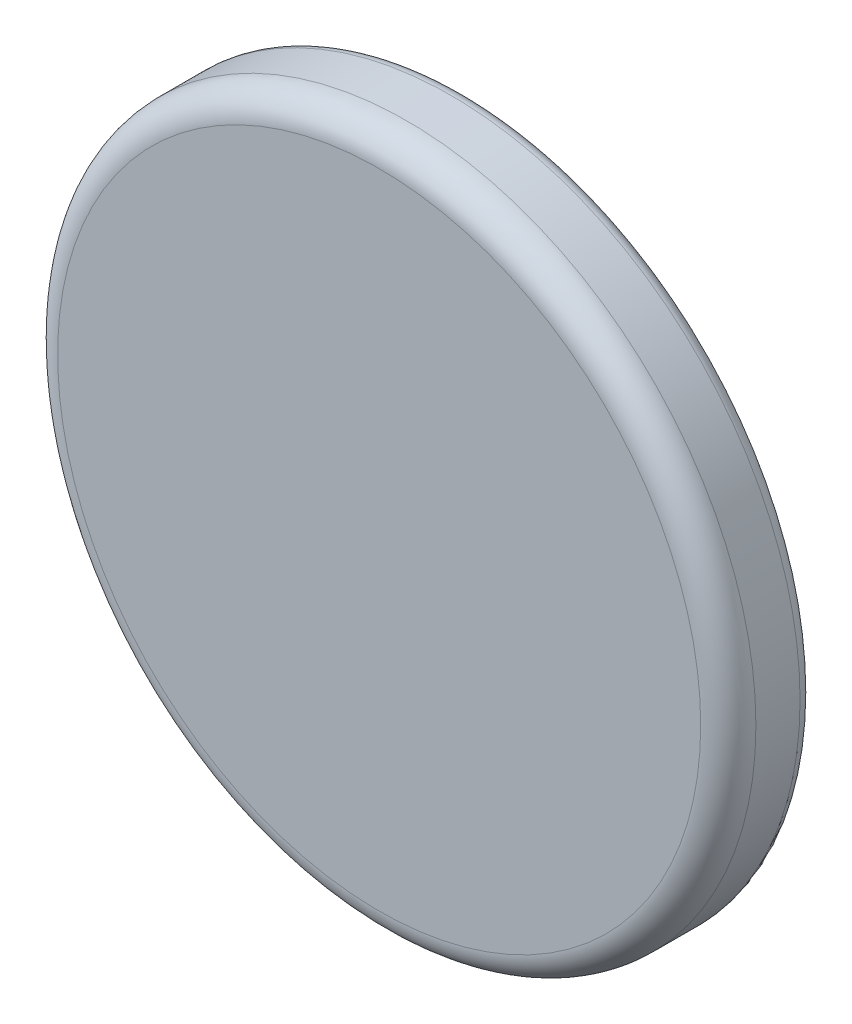
ISO-10303-21;
HEADER;
FILE_DESCRIPTION(('STEP AP214'),'2;1');
FILE_NAME('part.step','',(''),(''),'','','');
FILE_SCHEMA(('AUTOMOTIVE_DESIGN { 1 0 10303 214 1 1 1 1 }'));
ENDSEC;
DATA;
#1=APPLICATION_CONTEXT('core data for automotive mechanical design processes');
#2=APPLICATION_PROTOCOL_DEFINITION('international standard','automotive_design',2000,#1);
#3=PRODUCT_CONTEXT('',#1,'mechanical');
#4=PRODUCT('Part','Part','',(#3));
#5=PRODUCT_RELATED_PRODUCT_CATEGORY('part','',(#4));
#6=PRODUCT_DEFINITION_FORMATION('','',#4);
#7=PRODUCT_DEFINITION_CONTEXT('part definition',#1,'design');
#8=PRODUCT_DEFINITION('design','',#6,#7);
#9=PRODUCT_DEFINITION_SHAPE('','',#8);
#10=(LENGTH_UNIT() NAMED_UNIT(*) SI_UNIT(.MILLI.,.METRE.));
#11=(NAMED_UNIT(*) PLANE_ANGLE_UNIT() SI_UNIT($,.RADIAN.));
#12=(NAMED_UNIT(*) SI_UNIT($,.STERADIAN.) SOLID_ANGLE_UNIT());
#13=UNCERTAINTY_MEASURE_WITH_UNIT(LENGTH_MEASURE(1.E-05),#10,'distance_accuracy_value','');
#14=(GEOMETRIC_REPRESENTATION_CONTEXT(3) GLOBAL_UNCERTAINTY_ASSIGNED_CONTEXT((#13)) GLOBAL_UNIT_ASSIGNED_CONTEXT((#10,
#11,#12)) REPRESENTATION_CONTEXT('',''));
#15=CARTESIAN_POINT('',(0.,0.,0.));
#16=DIRECTION('',(0.,0.,1.));
#17=DIRECTION('',(1.,0.,0.));
#18=AXIS2_PLACEMENT_3D('',#15,#16,#17);
#19=CARTESIAN_POINT('',(0.,0.,-1.6));
#20=DIRECTION('',(0.,0.,1.));
#21=DIRECTION('',(1.,0.,0.));
#22=AXIS2_PLACEMENT_3D('',#19,#20,#21);
#23=TOROIDAL_SURFACE('',#22,12.15,0.5);
#24=CARTESIAN_POINT('',(0.,0.,-1.6));
#25=DIRECTION('',(0.,0.,1.));
#26=DIRECTION('',(1.,0.,0.));
#27=AXIS2_PLACEMENT_3D('',#24,#25,#26);
#28=CIRCLE('',#27,12.65);
#29=CARTESIAN_POINT('',(12.65,0.,-1.6));
#30=VERTEX_POINT('',#29);
#31=EDGE_CURVE('E254',#30,#30,#28,.T.);
#32=ORIENTED_EDGE('',*,*,#31,.F.);
#33=EDGE_LOOP('',(#32));
#34=FACE_BOUND('',#33,.T.);
#35=CARTESIAN_POINT('',(0.,0.,-2.1));
#36=DIRECTION('',(0.,0.,1.));
#37=DIRECTION('',(1.,0.,0.));
#38=AXIS2_PLACEMENT_3D('',#35,#36,#37);
#39=CIRCLE('',#38,12.15);
#40=CARTESIAN_POINT('',(12.15,0.,-2.1));
#41=VERTEX_POINT('',#40);
#42=EDGE_CURVE('E250',#41,#41,#39,.T.);
#43=ORIENTED_EDGE('',*,*,#42,.T.);
#44=EDGE_LOOP('',(#43));
#45=FACE_BOUND('',#44,.T.);
#46=ADVANCED_FACE('F47',(#34,#45),#23,.T.);
#47=CARTESIAN_POINT('',(0.,0.,-1.6));
#48=DIRECTION('',(0.,0.,1.));
#49=DIRECTION('',(1.,0.,0.));
#50=AXIS2_PLACEMENT_3D('',#47,#48,#49);
#51=TOROIDAL_SURFACE('',#50,12.15,0.5);
#52=CARTESIAN_POINT('',(0.,0.,-1.6));
#53=DIRECTION('',(0.,0.,1.));
#54=DIRECTION('',(1.,0.,0.));
#55=AXIS2_PLACEMENT_3D('',#52,#53,#54);
#56=CIRCLE('',#55,11.65);
#57=CARTESIAN_POINT('',(11.65,0.,-1.6));
#58=VERTEX_POINT('',#57);
#59=EDGE_CURVE('E246',#58,#58,#56,.F.);
#60=ORIENTED_EDGE('',*,*,#59,.F.);
#61=EDGE_LOOP('',(#60));
#62=FACE_BOUND('',#61,.T.);
#63=ORIENTED_EDGE('',*,*,#42,.F.);
#64=EDGE_LOOP('',(#63));
#65=FACE_BOUND('',#64,.T.);
#66=ADVANCED_FACE('F276',(#62,#65),#51,.T.);
#67=CARTESIAN_POINT('',(0.55,0.,-2.1));
#68=DIRECTION('',(1.,0.,0.));
#69=DIRECTION('',(0.,1.,0.));
#70=AXIS2_PLACEMENT_3D('',#67,#68,#69);
#71=PLANE('',#70);
#72=DIRECTION('',(0.,1.,0.));
#73=VECTOR('',#72,1.);
#74=CARTESIAN_POINT('',(0.55,0.,0.));
#75=LINE('',#74,#73);
#76=CARTESIAN_POINT('',(0.550000000000001,-2.,0.));
#77=VERTEX_POINT('',#76);
#78=CARTESIAN_POINT('',(0.55,-0.55,0.));
#79=VERTEX_POINT('',#78);
#80=EDGE_CURVE('E136',#77,#79,#75,.T.);
#81=ORIENTED_EDGE('',*,*,#80,.T.);
#82=DIRECTION('',(0.,0.,1.));
#83=VECTOR('',#82,1.);
#84=CARTESIAN_POINT('',(0.55,-0.55,-2.1));
#85=LINE('',#84,#83);
#86=CARTESIAN_POINT('',(0.55,-0.55,-2.1));
#87=VERTEX_POINT('',#86);
#88=EDGE_CURVE('E145',#87,#79,#85,.T.);
#89=ORIENTED_EDGE('',*,*,#88,.F.);
#90=DIRECTION('',(0.,1.,0.));
#91=VECTOR('',#90,1.);
#92=CARTESIAN_POINT('',(0.55,0.,-2.1));
#93=LINE('',#92,#91);
#94=CARTESIAN_POINT('',(0.550000000000001,-2.,-2.1));
#95=VERTEX_POINT('',#94);
#96=EDGE_CURVE('E197',#95,#87,#93,.T.);
#97=ORIENTED_EDGE('',*,*,#96,.F.);
#98=DIRECTION('',(0.,0.,1.));
#99=VECTOR('',#98,1.);
#100=CARTESIAN_POINT('',(0.550000000000001,-2.,-2.1));
#101=LINE('',#100,#99);
#102=EDGE_CURVE('E156',#95,#77,#101,.T.);
#103=ORIENTED_EDGE('',*,*,#102,.T.);
#104=EDGE_LOOP('',(#81,#89,#97,#103));
#105=FACE_BOUND('',#104,.T.);
#106=ADVANCED_FACE('F154',(#105),#71,.F.);
#107=CARTESIAN_POINT('',(0.,-0.55,-2.1));
#108=DIRECTION('',(0.,-1.,0.));
#109=DIRECTION('',(1.,0.,0.));
#110=AXIS2_PLACEMENT_3D('',#107,#108,#109);
#111=PLANE('',#110);
#112=DIRECTION('',(1.,0.,0.));
#113=VECTOR('',#112,1.);
#114=CARTESIAN_POINT('',(0.,-0.55,0.));
#115=LINE('',#114,#113);
#116=CARTESIAN_POINT('',(2.,-0.55,0.));
#117=VERTEX_POINT('',#116);
#118=EDGE_CURVE('E133',#79,#117,#115,.T.);
#119=ORIENTED_EDGE('',*,*,#118,.T.);
#120=DIRECTION('',(0.,0.,1.));
#121=VECTOR('',#120,1.);
#122=CARTESIAN_POINT('',(2.,-0.55,-2.1));
#123=LINE('',#122,#121);
#124=CARTESIAN_POINT('',(2.,-0.55,-2.1));
#125=VERTEX_POINT('',#124);
#126=EDGE_CURVE('E151',#125,#117,#123,.T.);
#127=ORIENTED_EDGE('',*,*,#126,.F.);
#128=DIRECTION('',(1.,0.,0.));
#129=VECTOR('',#128,1.);
#130=CARTESIAN_POINT('',(0.,-0.55,-2.1));
#131=LINE('',#130,#129);
#132=EDGE_CURVE('E64',#87,#125,#131,.T.);
#133=ORIENTED_EDGE('',*,*,#132,.F.);
#134=ORIENTED_EDGE('',*,*,#88,.T.);
#135=EDGE_LOOP('',(#119,#127,#133,#134));
#136=FACE_BOUND('',#135,.T.);
#137=ADVANCED_FACE('F146',(#136),#111,.F.);
#138=CARTESIAN_POINT('',(2.,0.,-2.1));
#139=DIRECTION('',(-1.,0.,0.));
#140=DIRECTION('',(0.,-1.,0.));
#141=AXIS2_PLACEMENT_3D('',#138,#139,#140);
#142=PLANE('',#141);
#143=DIRECTION('',(0.,-1.,0.));
#144=VECTOR('',#143,1.);
#145=CARTESIAN_POINT('',(2.,0.,0.));
#146=LINE('',#145,#144);
#147=CARTESIAN_POINT('',(2.,0.550000000000001,0.));
#148=VERTEX_POINT('',#147);
#149=EDGE_CURVE('E139',#148,#117,#146,.T.);
#150=ORIENTED_EDGE('',*,*,#149,.F.);
#151=DIRECTION('',(0.,0.,1.));
#152=VECTOR('',#151,1.);
#153=CARTESIAN_POINT('',(2.,0.550000000000001,-2.1));
#154=LINE('',#153,#152);
#155=CARTESIAN_POINT('',(2.,0.550000000000001,-2.1));
#156=VERTEX_POINT('',#155);
#157=EDGE_CURVE('E201',#156,#148,#154,.T.);
#158=ORIENTED_EDGE('',*,*,#157,.F.);
#159=DIRECTION('',(0.,-1.,0.));
#160=VECTOR('',#159,1.);
#161=CARTESIAN_POINT('',(2.,0.,-2.1));
#162=LINE('',#161,#160);
#163=EDGE_CURVE('E499',#156,#125,#162,.T.);
#164=ORIENTED_EDGE('',*,*,#163,.T.);
#165=ORIENTED_EDGE('',*,*,#126,.T.);
#166=EDGE_LOOP('',(#150,#158,#164,#165));
#167=FACE_BOUND('',#166,.T.);
#168=ADVANCED_FACE('F325',(#167),#142,.T.);
#169=CARTESIAN_POINT('',(0.,0.55,-2.1));
#170=DIRECTION('',(0.,1.,0.));
#171=DIRECTION('',(-1.,0.,0.));
#172=AXIS2_PLACEMENT_3D('',#169,#170,#171);
#173=PLANE('',#172);
#174=DIRECTION('',(-1.,0.,0.));
#175=VECTOR('',#174,1.);
#176=CARTESIAN_POINT('',(0.,0.55,0.));
#177=LINE('',#176,#175);
#178=CARTESIAN_POINT('',(0.55,0.55,0.));
#179=VERTEX_POINT('',#178);
#180=EDGE_CURVE('E189',#148,#179,#177,.T.);
#181=ORIENTED_EDGE('',*,*,#180,.T.);
#182=DIRECTION('',(0.,0.,1.));
#183=VECTOR('',#182,1.);
#184=CARTESIAN_POINT('',(0.55,0.55,-2.1));
#185=LINE('',#184,#183);
#186=CARTESIAN_POINT('',(0.55,0.55,-2.1));
#187=VERTEX_POINT('',#186);
#188=EDGE_CURVE('E205',#187,#179,#185,.T.);
#189=ORIENTED_EDGE('',*,*,#188,.F.);
#190=DIRECTION('',(-1.,0.,0.));
#191=VECTOR('',#190,1.);
#192=CARTESIAN_POINT('',(0.,0.55,-2.1));
#193=LINE('',#192,#191);
#194=EDGE_CURVE('E503',#156,#187,#193,.T.);
#195=ORIENTED_EDGE('',*,*,#194,.F.);
#196=ORIENTED_EDGE('',*,*,#157,.T.);
#197=EDGE_LOOP('',(#181,#189,#195,#196));
#198=FACE_BOUND('',#197,.T.);
#199=ADVANCED_FACE('F321',(#198),#173,.F.);
#200=CARTESIAN_POINT('',(0.55,0.,-2.1));
#201=DIRECTION('',(-1.,0.,0.));
#202=DIRECTION('',(0.,-1.,0.));
#203=AXIS2_PLACEMENT_3D('',#200,#201,#202);
#204=PLANE('',#203);
#205=DIRECTION('',(0.,-1.,0.));
#206=VECTOR('',#205,1.);
#207=CARTESIAN_POINT('',(0.55,0.,0.));
#208=LINE('',#207,#206);
#209=CARTESIAN_POINT('',(0.55,2.,0.));
#210=VERTEX_POINT('',#209);
#211=EDGE_CURVE('E186',#210,#179,#208,.T.);
#212=ORIENTED_EDGE('',*,*,#211,.F.);
#213=DIRECTION('',(0.,0.,1.));
#214=VECTOR('',#213,1.);
#215=CARTESIAN_POINT('',(0.55,2.,-2.1));
#216=LINE('',#215,#214);
#217=CARTESIAN_POINT('',(0.55,2.,-2.1));
#218=VERTEX_POINT('',#217);
#219=EDGE_CURVE('E209',#218,#210,#216,.T.);
#220=ORIENTED_EDGE('',*,*,#219,.F.);
#221=DIRECTION('',(0.,-1.,0.));
#222=VECTOR('',#221,1.);
#223=CARTESIAN_POINT('',(0.55,0.,-2.1));
#224=LINE('',#223,#222);
#225=EDGE_CURVE('E508',#218,#187,#224,.T.);
#226=ORIENTED_EDGE('',*,*,#225,.T.);
#227=ORIENTED_EDGE('',*,*,#188,.T.);
#228=EDGE_LOOP('',(#212,#220,#226,#227));
#229=FACE_BOUND('',#228,.T.);
#230=ADVANCED_FACE('F317',(#229),#204,.T.);
#231=CARTESIAN_POINT('',(0.,2.,-2.1));
#232=DIRECTION('',(0.,1.,0.));
#233=DIRECTION('',(-1.,0.,0.));
#234=AXIS2_PLACEMENT_3D('',#231,#232,#233);
#235=PLANE('',#234);
#236=DIRECTION('',(-1.,0.,0.));
#237=VECTOR('',#236,1.);
#238=CARTESIAN_POINT('',(0.,2.,0.));
#239=LINE('',#238,#237);
#240=CARTESIAN_POINT('',(-0.55,2.,0.));
#241=VERTEX_POINT('',#240);
#242=EDGE_CURVE('E182',#210,#241,#239,.T.);
#243=ORIENTED_EDGE('',*,*,#242,.T.);
#244=DIRECTION('',(0.,0.,1.));
#245=VECTOR('',#244,1.);
#246=CARTESIAN_POINT('',(-0.55,2.,-2.1));
#247=LINE('',#246,#245);
#248=CARTESIAN_POINT('',(-0.55,2.,-2.1));
#249=VERTEX_POINT('',#248);
#250=EDGE_CURVE('E213',#249,#241,#247,.T.);
#251=ORIENTED_EDGE('',*,*,#250,.F.);
#252=DIRECTION('',(-1.,0.,0.));
#253=VECTOR('',#252,1.);
#254=CARTESIAN_POINT('',(0.,2.,-2.1));
#255=LINE('',#254,#253);
#256=EDGE_CURVE('E512',#218,#249,#255,.T.);
#257=ORIENTED_EDGE('',*,*,#256,.F.);
#258=ORIENTED_EDGE('',*,*,#219,.T.);
#259=EDGE_LOOP('',(#243,#251,#257,#258));
#260=FACE_BOUND('',#259,.T.);
#261=ADVANCED_FACE('F313',(#260),#235,.F.);
#262=CARTESIAN_POINT('',(-0.55,0.,-2.1));
#263=DIRECTION('',(1.,0.,0.));
#264=DIRECTION('',(0.,1.,0.));
#265=AXIS2_PLACEMENT_3D('',#262,#263,#264);
#266=PLANE('',#265);
#267=DIRECTION('',(0.,1.,0.));
#268=VECTOR('',#267,1.);
#269=CARTESIAN_POINT('',(-0.55,0.,0.));
#270=LINE('',#269,#268);
#271=CARTESIAN_POINT('',(-0.55,0.55,0.));
#272=VERTEX_POINT('',#271);
#273=EDGE_CURVE('E179',#272,#241,#270,.T.);
#274=ORIENTED_EDGE('',*,*,#273,.F.);
#275=DIRECTION('',(0.,0.,1.));
#276=VECTOR('',#275,1.);
#277=CARTESIAN_POINT('',(-0.55,0.55,-2.1));
#278=LINE('',#277,#276);
#279=CARTESIAN_POINT('',(-0.55,0.55,-2.1));
#280=VERTEX_POINT('',#279);
#281=EDGE_CURVE('E217',#280,#272,#278,.T.);
#282=ORIENTED_EDGE('',*,*,#281,.F.);
#283=DIRECTION('',(0.,1.,0.));
#284=VECTOR('',#283,1.);
#285=CARTESIAN_POINT('',(-0.55,0.,-2.1));
#286=LINE('',#285,#284);
#287=EDGE_CURVE('E515',#280,#249,#286,.T.);
#288=ORIENTED_EDGE('',*,*,#287,.T.);
#289=ORIENTED_EDGE('',*,*,#250,.T.);
#290=EDGE_LOOP('',(#274,#282,#288,#289));
#291=FACE_BOUND('',#290,.T.);
#292=ADVANCED_FACE('F309',(#291),#266,.T.);
#293=CARTESIAN_POINT('',(0.,0.55,-2.1));
#294=DIRECTION('',(0.,-1.,0.));
#295=DIRECTION('',(0.,0.,-1.));
#296=AXIS2_PLACEMENT_3D('',#293,#294,#295);
#297=PLANE('',#296);
#298=DIRECTION('',(1.,0.,0.));
#299=VECTOR('',#298,1.);
#300=CARTESIAN_POINT('',(0.,0.55,0.));
#301=LINE('',#300,#299);
#302=CARTESIAN_POINT('',(-2.,0.55,0.));
#303=VERTEX_POINT('',#302);
#304=EDGE_CURVE('E176',#303,#272,#301,.T.);
#305=ORIENTED_EDGE('',*,*,#304,.F.);
#306=DIRECTION('',(0.,0.,1.));
#307=VECTOR('',#306,1.);
#308=CARTESIAN_POINT('',(-2.,0.55,-2.1));
#309=LINE('',#308,#307);
#310=CARTESIAN_POINT('',(-2.,0.55,-2.1));
#311=VERTEX_POINT('',#310);
#312=EDGE_CURVE('E221',#311,#303,#309,.T.);
#313=ORIENTED_EDGE('',*,*,#312,.F.);
#314=DIRECTION('',(1.,0.,0.));
#315=VECTOR('',#314,1.);
#316=CARTESIAN_POINT('',(0.,0.55,-2.1));
#317=LINE('',#316,#315);
#318=EDGE_CURVE('E519',#311,#280,#317,.T.);
#319=ORIENTED_EDGE('',*,*,#318,.T.);
#320=ORIENTED_EDGE('',*,*,#281,.T.);
#321=EDGE_LOOP('',(#305,#313,#319,#320));
#322=FACE_BOUND('',#321,.T.);
#323=ADVANCED_FACE('F305',(#322),#297,.T.);
#324=CARTESIAN_POINT('',(-2.,0.,-2.1));
#325=DIRECTION('',(1.,0.,0.));
#326=DIRECTION('',(0.,0.,-1.));
#327=AXIS2_PLACEMENT_3D('',#324,#325,#326);
#328=PLANE('',#327);
#329=DIRECTION('',(0.,1.,0.));
#330=VECTOR('',#329,1.);
#331=CARTESIAN_POINT('',(-2.,0.,0.));
#332=LINE('',#331,#330);
#333=CARTESIAN_POINT('',(-2.,-0.55,0.));
#334=VERTEX_POINT('',#333);
#335=EDGE_CURVE('E173',#334,#303,#332,.T.);
#336=ORIENTED_EDGE('',*,*,#335,.F.);
#337=DIRECTION('',(0.,0.,1.));
#338=VECTOR('',#337,1.);
#339=CARTESIAN_POINT('',(-2.,-0.55,-2.1));
#340=LINE('',#339,#338);
#341=CARTESIAN_POINT('',(-2.,-0.55,-2.1));
#342=VERTEX_POINT('',#341);
#343=EDGE_CURVE('E225',#342,#334,#340,.T.);
#344=ORIENTED_EDGE('',*,*,#343,.F.);
#345=DIRECTION('',(0.,1.,0.));
#346=VECTOR('',#345,1.);
#347=CARTESIAN_POINT('',(-2.,0.,-2.1));
#348=LINE('',#347,#346);
#349=EDGE_CURVE('E523',#342,#311,#348,.T.);
#350=ORIENTED_EDGE('',*,*,#349,.T.);
#351=ORIENTED_EDGE('',*,*,#312,.T.);
#352=EDGE_LOOP('',(#336,#344,#350,#351));
#353=FACE_BOUND('',#352,.T.);
#354=ADVANCED_FACE('F301',(#353),#328,.T.);
#355=CARTESIAN_POINT('',(0.,-0.55,-2.1));
#356=DIRECTION('',(0.,-1.,0.));
#357=DIRECTION('',(0.,0.,-1.));
#358=AXIS2_PLACEMENT_3D('',#355,#356,#357);
#359=PLANE('',#358);
#360=DIRECTION('',(1.,0.,0.));
#361=VECTOR('',#360,1.);
#362=CARTESIAN_POINT('',(0.,-0.55,0.));
#363=LINE('',#362,#361);
#364=CARTESIAN_POINT('',(-0.55,-0.55,0.));
#365=VERTEX_POINT('',#364);
#366=EDGE_CURVE('E169',#334,#365,#363,.T.);
#367=ORIENTED_EDGE('',*,*,#366,.T.);
#368=DIRECTION('',(0.,0.,1.));
#369=VECTOR('',#368,1.);
#370=CARTESIAN_POINT('',(-0.55,-0.55,-2.1));
#371=LINE('',#370,#369);
#372=CARTESIAN_POINT('',(-0.55,-0.55,-2.1));
#373=VERTEX_POINT('',#372);
#374=EDGE_CURVE('E229',#373,#365,#371,.T.);
#375=ORIENTED_EDGE('',*,*,#374,.F.);
#376=DIRECTION('',(1.,0.,0.));
#377=VECTOR('',#376,1.);
#378=CARTESIAN_POINT('',(0.,-0.55,-2.1));
#379=LINE('',#378,#377);
#380=EDGE_CURVE('E527',#342,#373,#379,.T.);
#381=ORIENTED_EDGE('',*,*,#380,.F.);
#382=ORIENTED_EDGE('',*,*,#343,.T.);
#383=EDGE_LOOP('',(#367,#375,#381,#382));
#384=FACE_BOUND('',#383,.T.);
#385=ADVANCED_FACE('F297',(#384),#359,.F.);
#386=CARTESIAN_POINT('',(-0.55,0.,-2.1));
#387=DIRECTION('',(1.,0.,0.));
#388=DIRECTION('',(0.,1.,0.));
#389=AXIS2_PLACEMENT_3D('',#386,#387,#388);
#390=PLANE('',#389);
#391=DIRECTION('',(0.,1.,0.));
#392=VECTOR('',#391,1.);
#393=CARTESIAN_POINT('',(-0.55,0.,0.));
#394=LINE('',#393,#392);
#395=CARTESIAN_POINT('',(-0.55,-2.,0.));
#396=VERTEX_POINT('',#395);
#397=EDGE_CURVE('E161',#396,#365,#394,.T.);
#398=ORIENTED_EDGE('',*,*,#397,.F.);
#399=DIRECTION('',(0.,0.,1.));
#400=VECTOR('',#399,1.);
#401=CARTESIAN_POINT('',(-0.55,-2.,-2.1));
#402=LINE('',#401,#400);
#403=CARTESIAN_POINT('',(-0.55,-2.,-2.1));
#404=VERTEX_POINT('',#403);
#405=EDGE_CURVE('E233',#404,#396,#402,.T.);
#406=ORIENTED_EDGE('',*,*,#405,.F.);
#407=DIRECTION('',(0.,1.,0.));
#408=VECTOR('',#407,1.);
#409=CARTESIAN_POINT('',(-0.55,0.,-2.1));
#410=LINE('',#409,#408);
#411=EDGE_CURVE('E530',#404,#373,#410,.T.);
#412=ORIENTED_EDGE('',*,*,#411,.T.);
#413=ORIENTED_EDGE('',*,*,#374,.T.);
#414=EDGE_LOOP('',(#398,#406,#412,#413));
#415=FACE_BOUND('',#414,.T.);
#416=ADVANCED_FACE('F293',(#415),#390,.T.);
#417=CARTESIAN_POINT('',(0.,-2.,-2.1));
#418=DIRECTION('',(0.,-1.,0.));
#419=DIRECTION('',(0.,0.,-1.));
#420=AXIS2_PLACEMENT_3D('',#417,#418,#419);
#421=PLANE('',#420);
#422=DIRECTION('',(1.,0.,0.));
#423=VECTOR('',#422,1.);
#424=CARTESIAN_POINT('',(0.,-2.,0.));
#425=LINE('',#424,#423);
#426=EDGE_CURVE('E158',#396,#77,#425,.T.);
#427=ORIENTED_EDGE('',*,*,#426,.T.);
#428=ORIENTED_EDGE('',*,*,#102,.F.);
#429=DIRECTION('',(1.,0.,0.));
#430=VECTOR('',#429,1.);
#431=CARTESIAN_POINT('',(0.,-2.,-2.1));
#432=LINE('',#431,#430);
#433=EDGE_CURVE('E534',#404,#95,#432,.T.);
#434=ORIENTED_EDGE('',*,*,#433,.F.);
#435=ORIENTED_EDGE('',*,*,#405,.T.);
#436=EDGE_LOOP('',(#427,#428,#434,#435));
#437=FACE_BOUND('',#436,.T.);
#438=ADVANCED_FACE('F289',(#437),#421,.F.);
#439=CARTESIAN_POINT('',(0.,0.,-2.1));
#440=DIRECTION('',(0.,0.,1.));
#441=DIRECTION('',(1.,0.,0.));
#442=AXIS2_PLACEMENT_3D('',#439,#440,#441);
#443=CYLINDRICAL_SURFACE('',#442,2.4);
#444=CARTESIAN_POINT('',(0.,0.,-2.1));
#445=DIRECTION('',(0.,0.,1.));
#446=DIRECTION('',(1.,0.,0.));
#447=AXIS2_PLACEMENT_3D('',#444,#445,#446);
#448=CIRCLE('',#447,2.4);
#449=CARTESIAN_POINT('',(2.4,0.,-2.1));
#450=VERTEX_POINT('',#449);
#451=EDGE_CURVE('E164',#450,#450,#448,.T.);
#452=ORIENTED_EDGE('',*,*,#451,.T.);
#453=EDGE_LOOP('',(#452));
#454=FACE_BOUND('',#453,.T.);
#455=CARTESIAN_POINT('',(0.,0.,0.));
#456=DIRECTION('',(0.,0.,1.));
#457=DIRECTION('',(1.,0.,0.));
#458=AXIS2_PLACEMENT_3D('',#455,#456,#457);
#459=CIRCLE('',#458,2.4);
#460=CARTESIAN_POINT('',(2.4,0.,0.));
#461=VERTEX_POINT('',#460);
#462=EDGE_CURVE('E142',#461,#461,#459,.T.);
#463=ORIENTED_EDGE('',*,*,#462,.F.);
#464=EDGE_LOOP('',(#463));
#465=FACE_BOUND('',#464,.T.);
#466=ADVANCED_FACE('F292',(#454,#465),#443,.T.);
#467=CARTESIAN_POINT('',(0.,0.,-2.1));
#468=DIRECTION('',(0.,0.,1.));
#469=DIRECTION('',(1.,0.,0.));
#470=AXIS2_PLACEMENT_3D('',#467,#468,#469);
#471=PLANE('',#470);
#472=ORIENTED_EDGE('',*,*,#96,.T.);
#473=ORIENTED_EDGE('',*,*,#132,.T.);
#474=ORIENTED_EDGE('',*,*,#163,.F.);
#475=ORIENTED_EDGE('',*,*,#194,.T.);
#476=ORIENTED_EDGE('',*,*,#225,.F.);
#477=ORIENTED_EDGE('',*,*,#256,.T.);
#478=ORIENTED_EDGE('',*,*,#287,.F.);
#479=ORIENTED_EDGE('',*,*,#318,.F.);
#480=ORIENTED_EDGE('',*,*,#349,.F.);
#481=ORIENTED_EDGE('',*,*,#380,.T.);
#482=ORIENTED_EDGE('',*,*,#411,.F.);
#483=ORIENTED_EDGE('',*,*,#433,.T.);
#484=EDGE_LOOP('',(#472,#473,#474,#475,#476,#477,#478,#479,#480,#481,#482,#483));
#485=FACE_BOUND('',#484,.T.);
#486=ORIENTED_EDGE('',*,*,#451,.F.);
#487=EDGE_LOOP('',(#486));
#488=FACE_BOUND('',#487,.T.);
#489=ADVANCED_FACE('F334',(#485,#488),#471,.F.);
#490=CARTESIAN_POINT('',(0.,0.,0.));
#491=DIRECTION('',(0.,0.,1.));
#492=DIRECTION('',(1.,0.,0.));
#493=AXIS2_PLACEMENT_3D('',#490,#491,#492);
#494=PLANE('',#493);
#495=CARTESIAN_POINT('',(0.,0.,0.));
#496=DIRECTION('',(0.,0.,1.));
#497=DIRECTION('',(1.,0.,0.));
#498=AXIS2_PLACEMENT_3D('',#495,#496,#497);
#499=CIRCLE('',#498,10.65);
#500=CARTESIAN_POINT('',(10.65,0.,0.));
#501=VERTEX_POINT('',#500);
#502=EDGE_CURVE('E11',#501,#501,#499,.F.);
#503=ORIENTED_EDGE('',*,*,#502,.T.);
#504=EDGE_LOOP('',(#503));
#505=FACE_BOUND('',#504,.T.);
#506=ORIENTED_EDGE('',*,*,#462,.T.);
#507=EDGE_LOOP('',(#506));
#508=FACE_BOUND('',#507,.T.);
#509=ADVANCED_FACE('F338',(#505,#508),#494,.F.);
#510=ORIENTED_EDGE('',*,*,#80,.F.);
#511=ORIENTED_EDGE('',*,*,#426,.F.);
#512=ORIENTED_EDGE('',*,*,#397,.T.);
#513=ORIENTED_EDGE('',*,*,#366,.F.);
#514=ORIENTED_EDGE('',*,*,#335,.T.);
#515=ORIENTED_EDGE('',*,*,#304,.T.);
#516=ORIENTED_EDGE('',*,*,#273,.T.);
#517=ORIENTED_EDGE('',*,*,#242,.F.);
#518=ORIENTED_EDGE('',*,*,#211,.T.);
#519=ORIENTED_EDGE('',*,*,#180,.F.);
#520=ORIENTED_EDGE('',*,*,#149,.T.);
#521=ORIENTED_EDGE('',*,*,#118,.F.);
#522=EDGE_LOOP('',(#510,#511,#512,#513,#514,#515,#516,#517,#518,#519,#520,#521));
#523=FACE_BOUND('',#522,.T.);
#524=ADVANCED_FACE('F134',(#523),#494,.F.);
#525=CARTESIAN_POINT('',(0.,0.,-2.1));
#526=DIRECTION('',(0.,0.,1.));
#527=DIRECTION('',(1.,0.,0.));
#528=AXIS2_PLACEMENT_3D('',#525,#526,#527);
#529=CYLINDRICAL_SURFACE('',#528,11.65);
#530=CARTESIAN_POINT('',(0.,0.,-1.));
#531=DIRECTION('',(0.,0.,1.));
#532=DIRECTION('',(1.,0.,0.));
#533=AXIS2_PLACEMENT_3D('',#530,#531,#532);
#534=CIRCLE('',#533,11.65);
#535=CARTESIAN_POINT('',(11.65,0.,-1.));
#536=VERTEX_POINT('',#535);
#537=EDGE_CURVE('E57',#536,#536,#534,.T.);
#538=ORIENTED_EDGE('',*,*,#537,.T.);
#539=EDGE_LOOP('',(#538));
#540=FACE_BOUND('',#539,.T.);
#541=ORIENTED_EDGE('',*,*,#59,.T.);
#542=EDGE_LOOP('',(#541));
#543=FACE_BOUND('',#542,.T.);
#544=ADVANCED_FACE('F261',(#540,#543),#529,.F.);
#545=CARTESIAN_POINT('',(0.,0.,-2.1));
#546=DIRECTION('',(0.,0.,1.));
#547=DIRECTION('',(1.,0.,0.));
#548=AXIS2_PLACEMENT_3D('',#545,#546,#547);
#549=CYLINDRICAL_SURFACE('',#548,12.65);
#550=ORIENTED_EDGE('',*,*,#31,.T.);
#551=EDGE_LOOP('',(#550));
#552=FACE_BOUND('',#551,.T.);
#553=CARTESIAN_POINT('',(0.,0.,0.));
#554=DIRECTION('',(0.,0.,1.));
#555=DIRECTION('',(1.,0.,0.));
#556=AXIS2_PLACEMENT_3D('',#553,#554,#555);
#557=CIRCLE('',#556,12.65);
#558=CARTESIAN_POINT('',(12.65,0.,0.));
#559=VERTEX_POINT('',#558);
#560=EDGE_CURVE('E242',#559,#559,#557,.F.);
#561=ORIENTED_EDGE('',*,*,#560,.T.);
#562=EDGE_LOOP('',(#561));
#563=FACE_BOUND('',#562,.T.);
#564=ADVANCED_FACE('F345',(#552,#563),#549,.T.);
#565=CARTESIAN_POINT('',(0.,0.,1.));
#566=DIRECTION('',(0.,0.,1.));
#567=DIRECTION('',(1.,0.,0.));
#568=AXIS2_PLACEMENT_3D('',#565,#566,#567);
#569=PLANE('',#568);
#570=CARTESIAN_POINT('',(0.,0.,1.));
#571=DIRECTION('',(0.,0.,1.));
#572=DIRECTION('',(1.,0.,0.));
#573=AXIS2_PLACEMENT_3D('',#570,#571,#572);
#574=CIRCLE('',#573,11.65);
#575=CARTESIAN_POINT('',(11.65,0.,1.));
#576=VERTEX_POINT('',#575);
#577=EDGE_CURVE('E150',#576,#576,#574,.T.);
#578=ORIENTED_EDGE('',*,*,#577,.T.);
#579=EDGE_LOOP('',(#578));
#580=FACE_BOUND('',#579,.T.);
#581=ADVANCED_FACE('F271',(#580),#569,.T.);
#582=CARTESIAN_POINT('',(0.,0.,0.));
#583=DIRECTION('',(0.,0.,1.));
#584=DIRECTION('',(1.,0.,0.));
#585=AXIS2_PLACEMENT_3D('',#582,#583,#584);
#586=TOROIDAL_SURFACE('',#585,11.65,1.);
#587=ORIENTED_EDGE('',*,*,#560,.F.);
#588=EDGE_LOOP('',(#587));
#589=FACE_BOUND('',#588,.T.);
#590=ORIENTED_EDGE('',*,*,#577,.F.);
#591=EDGE_LOOP('',(#590));
#592=FACE_BOUND('',#591,.T.);
#593=ADVANCED_FACE('F265',(#589,#592),#586,.T.);
#594=CARTESIAN_POINT('',(0.,0.,-1.));
#595=DIRECTION('',(0.,0.,1.));
#596=DIRECTION('',(1.,0.,0.));
#597=AXIS2_PLACEMENT_3D('',#594,#595,#596);
#598=TOROIDAL_SURFACE('',#597,10.65,1.);
#599=ORIENTED_EDGE('',*,*,#502,.F.);
#600=EDGE_LOOP('',(#599));
#601=FACE_BOUND('',#600,.T.);
#602=ORIENTED_EDGE('',*,*,#537,.F.);
#603=EDGE_LOOP('',(#602));
#604=FACE_BOUND('',#603,.T.);
#605=ADVANCED_FACE('F49',(#601,#604),#598,.F.);
#606=CLOSED_SHELL('',(#46,#66,#106,#137,#168,#199,#230,#261,#292,#323,#354,#385,#416,#438,#466,
#489,#509,#524,#544,#564,#581,#593,#605));
#607=MANIFOLD_SOLID_BREP('B2',#606);
#608=ADVANCED_BREP_SHAPE_REPRESENTATION('',(#18,#607),#14);
#609=SHAPE_DEFINITION_REPRESENTATION(#9,#608);
ENDSEC;
END-ISO-10303-21;
